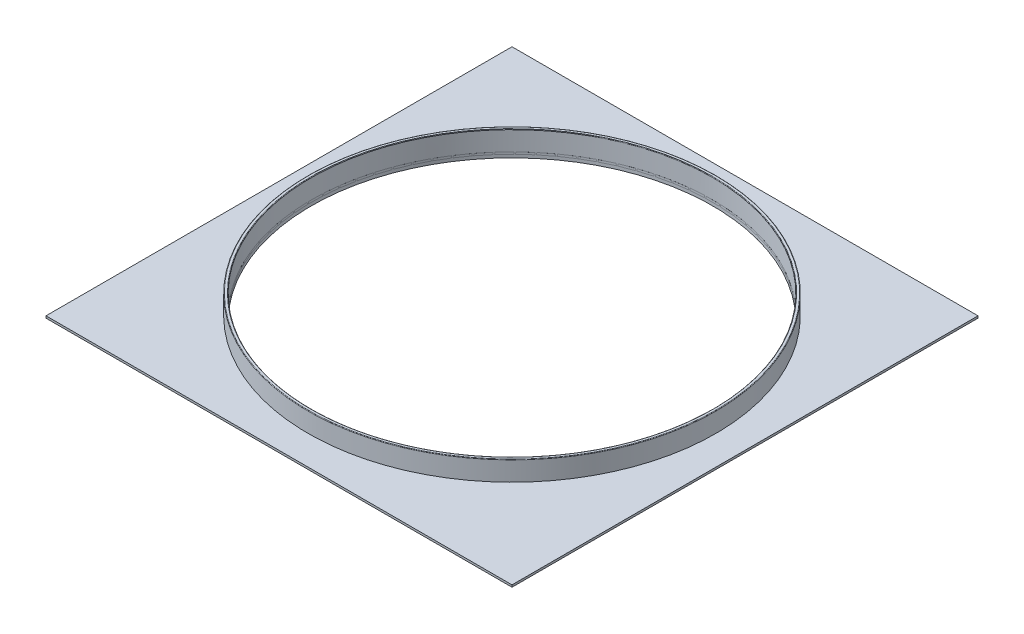
ISO-10303-21;
HEADER;
FILE_DESCRIPTION(('STEP AP214'),'2;1');
FILE_NAME('part.step','',(''),(''),'','','');
FILE_SCHEMA(('AUTOMOTIVE_DESIGN { 1 0 10303 214 1 1 1 1 }'));
ENDSEC;
DATA;
#1=APPLICATION_CONTEXT('core data for automotive mechanical design processes');
#2=APPLICATION_PROTOCOL_DEFINITION('international standard','automotive_design',2000,#1);
#3=PRODUCT_CONTEXT('',#1,'mechanical');
#4=PRODUCT('Part','Part','',(#3));
#5=PRODUCT_RELATED_PRODUCT_CATEGORY('part','',(#4));
#6=PRODUCT_DEFINITION_FORMATION('','',#4);
#7=PRODUCT_DEFINITION_CONTEXT('part definition',#1,'design');
#8=PRODUCT_DEFINITION('design','',#6,#7);
#9=PRODUCT_DEFINITION_SHAPE('','',#8);
#10=(LENGTH_UNIT() NAMED_UNIT(*) SI_UNIT(.MILLI.,.METRE.));
#11=(NAMED_UNIT(*) PLANE_ANGLE_UNIT() SI_UNIT($,.RADIAN.));
#12=(NAMED_UNIT(*) SI_UNIT($,.STERADIAN.) SOLID_ANGLE_UNIT());
#13=UNCERTAINTY_MEASURE_WITH_UNIT(LENGTH_MEASURE(1.E-05),#10,'distance_accuracy_value','');
#14=(GEOMETRIC_REPRESENTATION_CONTEXT(3) GLOBAL_UNCERTAINTY_ASSIGNED_CONTEXT((#13)) GLOBAL_UNIT_ASSIGNED_CONTEXT((#10,
#11,#12)) REPRESENTATION_CONTEXT('',''));
#15=CARTESIAN_POINT('',(0.,0.,0.));
#16=DIRECTION('',(0.,0.,1.));
#17=DIRECTION('',(1.,0.,0.));
#18=AXIS2_PLACEMENT_3D('',#15,#16,#17);
#19=CARTESIAN_POINT('',(0.,7.93749999999999,0.));
#20=DIRECTION('',(0.,1.,0.));
#21=DIRECTION('',(0.,0.,1.));
#22=AXIS2_PLACEMENT_3D('',#19,#20,#21);
#23=PLANE('',#22);
#24=DIRECTION('',(0.,0.,-1.));
#25=VECTOR('',#24,1.);
#26=CARTESIAN_POINT('',(355.6,7.93749999999999,-355.6));
#27=LINE('',#26,#25);
#28=CARTESIAN_POINT('',(355.6,7.93749999999998,355.6));
#29=VERTEX_POINT('',#28);
#30=CARTESIAN_POINT('',(355.6,7.93749999999999,-355.6));
#31=VERTEX_POINT('',#30);
#32=EDGE_CURVE('E99',#29,#31,#27,.T.);
#33=ORIENTED_EDGE('',*,*,#32,.T.);
#34=DIRECTION('',(-1.,0.,0.));
#35=VECTOR('',#34,1.);
#36=CARTESIAN_POINT('',(-355.6,7.93749999999999,-355.6));
#37=LINE('',#36,#35);
#38=CARTESIAN_POINT('',(-355.6,7.93749999999999,-355.6));
#39=VERTEX_POINT('',#38);
#40=EDGE_CURVE('E94',#31,#39,#37,.T.);
#41=ORIENTED_EDGE('',*,*,#40,.T.);
#42=DIRECTION('',(0.,0.,1.));
#43=VECTOR('',#42,1.);
#44=CARTESIAN_POINT('',(-355.6,7.93749999999999,-355.6));
#45=LINE('',#44,#43);
#46=CARTESIAN_POINT('',(-355.6,7.93749999999998,355.6));
#47=VERTEX_POINT('',#46);
#48=EDGE_CURVE('E97',#39,#47,#45,.T.);
#49=ORIENTED_EDGE('',*,*,#48,.T.);
#50=DIRECTION('',(1.,0.,0.));
#51=VECTOR('',#50,1.);
#52=CARTESIAN_POINT('',(-355.6,7.93749999999998,355.6));
#53=LINE('',#52,#51);
#54=EDGE_CURVE('E64',#47,#29,#53,.T.);
#55=ORIENTED_EDGE('',*,*,#54,.T.);
#56=EDGE_LOOP('',(#33,#41,#49,#55));
#57=FACE_BOUND('',#56,.T.);
#58=CARTESIAN_POINT('',(0.,7.93749999999999,0.));
#59=DIRECTION('',(0.,1.,0.));
#60=DIRECTION('',(0.,0.,1.));
#61=AXIS2_PLACEMENT_3D('',#58,#59,#60);
#62=CIRCLE('',#61,306.3875);
#63=CARTESIAN_POINT('',(0.,7.93749999999998,306.3875));
#64=VERTEX_POINT('',#63);
#65=EDGE_CURVE('E114',#64,#64,#62,.T.);
#66=ORIENTED_EDGE('',*,*,#65,.F.);
#67=EDGE_LOOP('',(#66));
#68=FACE_BOUND('',#67,.T.);
#69=ADVANCED_FACE('F47',(#57,#68),#23,.T.);
#70=CARTESIAN_POINT('',(0.,4.76249999999999,0.));
#71=DIRECTION('',(0.,1.,0.));
#72=DIRECTION('',(0.,0.,1.));
#73=AXIS2_PLACEMENT_3D('',#70,#71,#72);
#74=PLANE('',#73);
#75=DIRECTION('',(0.,0.,-1.));
#76=VECTOR('',#75,1.);
#77=CARTESIAN_POINT('',(355.6,4.76249999999999,-355.6));
#78=LINE('',#77,#76);
#79=CARTESIAN_POINT('',(355.6,4.76249999999998,355.6));
#80=VERTEX_POINT('',#79);
#81=CARTESIAN_POINT('',(355.6,4.76249999999999,-355.6));
#82=VERTEX_POINT('',#81);
#83=EDGE_CURVE('E111',#80,#82,#78,.T.);
#84=ORIENTED_EDGE('',*,*,#83,.F.);
#85=DIRECTION('',(1.,0.,0.));
#86=VECTOR('',#85,1.);
#87=CARTESIAN_POINT('',(-355.6,4.76249999999998,355.6));
#88=LINE('',#87,#86);
#89=CARTESIAN_POINT('',(-355.6,4.76249999999998,355.6));
#90=VERTEX_POINT('',#89);
#91=EDGE_CURVE('E87',#90,#80,#88,.T.);
#92=ORIENTED_EDGE('',*,*,#91,.F.);
#93=DIRECTION('',(0.,0.,1.));
#94=VECTOR('',#93,1.);
#95=CARTESIAN_POINT('',(-355.6,4.76249999999999,-355.6));
#96=LINE('',#95,#94);
#97=CARTESIAN_POINT('',(-355.6,4.76249999999999,-355.6));
#98=VERTEX_POINT('',#97);
#99=EDGE_CURVE('E81',#98,#90,#96,.T.);
#100=ORIENTED_EDGE('',*,*,#99,.F.);
#101=DIRECTION('',(-1.,0.,0.));
#102=VECTOR('',#101,1.);
#103=CARTESIAN_POINT('',(-355.6,4.76249999999999,-355.6));
#104=LINE('',#103,#102);
#105=EDGE_CURVE('E103',#82,#98,#104,.T.);
#106=ORIENTED_EDGE('',*,*,#105,.F.);
#107=EDGE_LOOP('',(#84,#92,#100,#106));
#108=FACE_BOUND('',#107,.T.);
#109=CARTESIAN_POINT('',(0.,4.76249999999999,0.));
#110=DIRECTION('',(0.,1.,0.));
#111=DIRECTION('',(0.,0.,1.));
#112=AXIS2_PLACEMENT_3D('',#109,#110,#111);
#113=CIRCLE('',#112,306.3875);
#114=CARTESIAN_POINT('',(0.,4.76249999999998,306.3875));
#115=VERTEX_POINT('',#114);
#116=EDGE_CURVE('E126',#115,#115,#113,.T.);
#117=ORIENTED_EDGE('',*,*,#116,.T.);
#118=EDGE_LOOP('',(#117));
#119=FACE_BOUND('',#118,.T.);
#120=ADVANCED_FACE('F122',(#108,#119),#74,.F.);
#121=CARTESIAN_POINT('',(355.6,7.93749999999999,-355.6));
#122=DIRECTION('',(-1.,0.,0.));
#123=DIRECTION('',(0.,0.,1.));
#124=AXIS2_PLACEMENT_3D('',#121,#122,#123);
#125=PLANE('',#124);
#126=ORIENTED_EDGE('',*,*,#83,.T.);
#127=DIRECTION('',(0.,-1.,0.));
#128=VECTOR('',#127,1.);
#129=CARTESIAN_POINT('',(355.6,7.93749999999999,-355.6));
#130=LINE('',#129,#128);
#131=EDGE_CURVE('E12',#31,#82,#130,.T.);
#132=ORIENTED_EDGE('',*,*,#131,.F.);
#133=ORIENTED_EDGE('',*,*,#32,.F.);
#134=DIRECTION('',(0.,-1.,0.));
#135=VECTOR('',#134,1.);
#136=CARTESIAN_POINT('',(355.6,7.93749999999998,355.6));
#137=LINE('',#136,#135);
#138=EDGE_CURVE('E107',#29,#80,#137,.T.);
#139=ORIENTED_EDGE('',*,*,#138,.T.);
#140=EDGE_LOOP('',(#126,#132,#133,#139));
#141=FACE_BOUND('',#140,.T.);
#142=ADVANCED_FACE('F49',(#141),#125,.F.);
#143=CARTESIAN_POINT('',(-355.6,7.93749999999999,-355.6));
#144=DIRECTION('',(0.,0.,1.));
#145=DIRECTION('',(0.,-1.,0.));
#146=AXIS2_PLACEMENT_3D('',#143,#144,#145);
#147=PLANE('',#146);
#148=ORIENTED_EDGE('',*,*,#105,.T.);
#149=DIRECTION('',(0.,-1.,0.));
#150=VECTOR('',#149,1.);
#151=CARTESIAN_POINT('',(-355.6,7.93749999999999,-355.6));
#152=LINE('',#151,#150);
#153=EDGE_CURVE('E56',#39,#98,#152,.T.);
#154=ORIENTED_EDGE('',*,*,#153,.F.);
#155=ORIENTED_EDGE('',*,*,#40,.F.);
#156=ORIENTED_EDGE('',*,*,#131,.T.);
#157=EDGE_LOOP('',(#148,#154,#155,#156));
#158=FACE_BOUND('',#157,.T.);
#159=ADVANCED_FACE('F102',(#158),#147,.F.);
#160=CARTESIAN_POINT('',(-355.6,7.93749999999999,-355.6));
#161=DIRECTION('',(1.,0.,0.));
#162=DIRECTION('',(0.,0.,-1.));
#163=AXIS2_PLACEMENT_3D('',#160,#161,#162);
#164=PLANE('',#163);
#165=ORIENTED_EDGE('',*,*,#99,.T.);
#166=DIRECTION('',(0.,-1.,0.));
#167=VECTOR('',#166,1.);
#168=CARTESIAN_POINT('',(-355.6,7.93749999999998,355.6));
#169=LINE('',#168,#167);
#170=EDGE_CURVE('E104',#47,#90,#169,.T.);
#171=ORIENTED_EDGE('',*,*,#170,.F.);
#172=ORIENTED_EDGE('',*,*,#48,.F.);
#173=ORIENTED_EDGE('',*,*,#153,.T.);
#174=EDGE_LOOP('',(#165,#171,#172,#173));
#175=FACE_BOUND('',#174,.T.);
#176=ADVANCED_FACE('F105',(#175),#164,.F.);
#177=CARTESIAN_POINT('',(-355.6,7.93749999999998,355.6));
#178=DIRECTION('',(0.,0.,-1.));
#179=DIRECTION('',(0.,1.,0.));
#180=AXIS2_PLACEMENT_3D('',#177,#178,#179);
#181=PLANE('',#180);
#182=ORIENTED_EDGE('',*,*,#91,.T.);
#183=ORIENTED_EDGE('',*,*,#138,.F.);
#184=ORIENTED_EDGE('',*,*,#54,.F.);
#185=ORIENTED_EDGE('',*,*,#170,.T.);
#186=EDGE_LOOP('',(#182,#183,#184,#185));
#187=FACE_BOUND('',#186,.T.);
#188=ADVANCED_FACE('F119',(#187),#181,.F.);
#189=CARTESIAN_POINT('',(0.,7.93749999999999,0.));
#190=DIRECTION('',(0.,-1.,0.));
#191=DIRECTION('',(0.,0.,-1.));
#192=AXIS2_PLACEMENT_3D('',#189,#190,#191);
#193=CYLINDRICAL_SURFACE('',#192,306.3875);
#194=ORIENTED_EDGE('',*,*,#65,.T.);
#195=EDGE_LOOP('',(#194));
#196=FACE_BOUND('',#195,.T.);
#197=ORIENTED_EDGE('',*,*,#116,.F.);
#198=EDGE_LOOP('',(#197));
#199=FACE_BOUND('',#198,.T.);
#200=ADVANCED_FACE('F132',(#196,#199),#193,.F.);
#201=CLOSED_SHELL('',(#69,#120,#142,#159,#176,#188,#200));
#202=MANIFOLD_SOLID_BREP('B2',#201);
#203=CARTESIAN_POINT('',(0.,38.1,0.));
#204=DIRECTION('',(0.,1.,0.));
#205=DIRECTION('',(0.,0.,1.));
#206=AXIS2_PLACEMENT_3D('',#203,#204,#205);
#207=CYLINDRICAL_SURFACE('',#206,349.25);
#208=CARTESIAN_POINT('',(0.,0.793749999999996,0.));
#209=DIRECTION('',(0.,1.,0.));
#210=DIRECTION('',(0.,0.,1.));
#211=AXIS2_PLACEMENT_3D('',#208,#209,#210);
#212=CIRCLE('',#211,349.25);
#213=CARTESIAN_POINT('',(0.,0.793749999999989,349.25));
#214=VERTEX_POINT('',#213);
#215=EDGE_CURVE('E232',#214,#214,#212,.T.);
#216=ORIENTED_EDGE('',*,*,#215,.T.);
#217=EDGE_LOOP('',(#216));
#218=FACE_BOUND('',#217,.T.);
#219=CARTESIAN_POINT('',(0.,3.96874999999999,0.));
#220=DIRECTION('',(0.,-1.,0.));
#221=DIRECTION('',(0.,0.,-1.));
#222=AXIS2_PLACEMENT_3D('',#219,#220,#221);
#223=CIRCLE('',#222,349.25);
#224=CARTESIAN_POINT('',(0.,3.96874999999999,-349.25));
#225=VERTEX_POINT('',#224);
#226=EDGE_CURVE('E236',#225,#225,#223,.T.);
#227=ORIENTED_EDGE('',*,*,#226,.T.);
#228=EDGE_LOOP('',(#227));
#229=FACE_BOUND('',#228,.T.);
#230=ADVANCED_FACE('F192',(#218,#229),#207,.T.);
#231=CARTESIAN_POINT('',(0.,4.76249999999999,-349.25));
#232=DIRECTION('',(0.,-1.,0.));
#233=DIRECTION('',(0.,0.,-1.));
#234=AXIS2_PLACEMENT_3D('',#231,#232,#233);
#235=PLANE('',#234);
#236=CARTESIAN_POINT('',(164.306249999996,4.76249999999998,-284.586773001116));
#237=DIRECTION('',(0.,1.,0.));
#238=DIRECTION('',(-0.499999999999989,0.,0.866025403784445));
#239=AXIS2_PLACEMENT_3D('',#236,#237,#238);
#240=CIRCLE('',#239,5.55625000000001);
#241=CARTESIAN_POINT('',(161.528124999996,4.76249999999998,-279.774919351339));
#242=VERTEX_POINT('',#241);
#243=EDGE_CURVE('E333',#242,#242,#240,.T.);
#244=ORIENTED_EDGE('',*,*,#243,.F.);
#245=EDGE_LOOP('',(#244));
#246=FACE_BOUND('',#245,.T.);
#247=CARTESIAN_POINT('',(284.586773001112,4.76249999999998,-164.306250000003));
#248=DIRECTION('',(0.,1.,0.));
#249=DIRECTION('',(-0.866025403784433,0.,0.50000000000001));
#250=AXIS2_PLACEMENT_3D('',#247,#248,#249);
#251=CIRCLE('',#250,5.55625000000001);
#252=CARTESIAN_POINT('',(279.774919351335,4.76249999999998,-161.528125000003));
#253=VERTEX_POINT('',#252);
#254=EDGE_CURVE('E325',#253,#253,#251,.T.);
#255=ORIENTED_EDGE('',*,*,#254,.F.);
#256=EDGE_LOOP('',(#255));
#257=FACE_BOUND('',#256,.T.);
#258=CARTESIAN_POINT('',(328.6125,4.76249999999997,-3.44193602804208E-12));
#259=DIRECTION('',(0.,1.,0.));
#260=DIRECTION('',(-1.,0.,0.));
#261=AXIS2_PLACEMENT_3D('',#258,#259,#260);
#262=CIRCLE('',#261,5.55625000000001);
#263=CARTESIAN_POINT('',(323.05625,4.76249999999997,-3.38373739847524E-12));
#264=VERTEX_POINT('',#263);
#265=EDGE_CURVE('E317',#264,#264,#262,.T.);
#266=ORIENTED_EDGE('',*,*,#265,.F.);
#267=EDGE_LOOP('',(#266));
#268=FACE_BOUND('',#267,.T.);
#269=CARTESIAN_POINT('',(284.586773001115,4.76249999999997,164.306249999997));
#270=DIRECTION('',(0.,1.,0.));
#271=DIRECTION('',(-0.866025403784443,0.,-0.499999999999992));
#272=AXIS2_PLACEMENT_3D('',#269,#270,#271);
#273=CIRCLE('',#272,5.55625000000001);
#274=CARTESIAN_POINT('',(279.774919351338,4.76249999999997,161.528124999997));
#275=VERTEX_POINT('',#274);
#276=EDGE_CURVE('E309',#275,#275,#273,.T.);
#277=ORIENTED_EDGE('',*,*,#276,.F.);
#278=EDGE_LOOP('',(#277));
#279=FACE_BOUND('',#278,.T.);
#280=CARTESIAN_POINT('',(164.306250000002,4.76249999999997,284.586773001113));
#281=DIRECTION('',(0.,1.,0.));
#282=DIRECTION('',(-0.500000000000007,0.,-0.866025403784435));
#283=AXIS2_PLACEMENT_3D('',#280,#281,#282);
#284=CIRCLE('',#283,5.55625000000001);
#285=CARTESIAN_POINT('',(161.528125000002,4.76249999999997,279.774919351335));
#286=VERTEX_POINT('',#285);
#287=EDGE_CURVE('E301',#286,#286,#284,.T.);
#288=ORIENTED_EDGE('',*,*,#287,.F.);
#289=EDGE_LOOP('',(#288));
#290=FACE_BOUND('',#289,.T.);
#291=CARTESIAN_POINT('',(0.,4.76249999999997,328.6125));
#292=DIRECTION('',(0.,1.,0.));
#293=DIRECTION('',(0.,0.,-1.));
#294=AXIS2_PLACEMENT_3D('',#291,#292,#293);
#295=CIRCLE('',#294,5.55625000000001);
#296=CARTESIAN_POINT('',(0.,4.76249999999997,323.05625));
#297=VERTEX_POINT('',#296);
#298=EDGE_CURVE('E293',#297,#297,#295,.T.);
#299=ORIENTED_EDGE('',*,*,#298,.F.);
#300=EDGE_LOOP('',(#299));
#301=FACE_BOUND('',#300,.T.);
#302=CARTESIAN_POINT('',(-164.306249999998,4.76249999999997,284.586773001115));
#303=DIRECTION('',(0.,1.,0.));
#304=DIRECTION('',(0.499999999999995,0.,-0.866025403784442));
#305=AXIS2_PLACEMENT_3D('',#302,#303,#304);
#306=CIRCLE('',#305,5.55625000000001);
#307=CARTESIAN_POINT('',(-161.528124999998,4.76249999999997,279.774919351337));
#308=VERTEX_POINT('',#307);
#309=EDGE_CURVE('E285',#308,#308,#306,.T.);
#310=ORIENTED_EDGE('',*,*,#309,.F.);
#311=EDGE_LOOP('',(#310));
#312=FACE_BOUND('',#311,.T.);
#313=CARTESIAN_POINT('',(-284.586773001113,4.76249999999997,164.306250000001));
#314=DIRECTION('',(0.,1.,0.));
#315=DIRECTION('',(0.866025403784436,0.,-0.500000000000004));
#316=AXIS2_PLACEMENT_3D('',#313,#314,#315);
#317=CIRCLE('',#316,5.55625000000001);
#318=CARTESIAN_POINT('',(-279.774919351336,4.76249999999997,161.528125000001));
#319=VERTEX_POINT('',#318);
#320=EDGE_CURVE('E277',#319,#319,#317,.T.);
#321=ORIENTED_EDGE('',*,*,#320,.F.);
#322=EDGE_LOOP('',(#321));
#323=FACE_BOUND('',#322,.T.);
#324=CARTESIAN_POINT('',(-328.6125,4.76249999999997,1.14744161780027E-12));
#325=DIRECTION('',(0.,1.,0.));
#326=DIRECTION('',(1.,0.,0.));
#327=AXIS2_PLACEMENT_3D('',#324,#325,#326);
#328=CIRCLE('',#327,5.55625000000001);
#329=CARTESIAN_POINT('',(-323.05625,4.76249999999997,1.12804207461132E-12));
#330=VERTEX_POINT('',#329);
#331=EDGE_CURVE('E269',#330,#330,#328,.T.);
#332=ORIENTED_EDGE('',*,*,#331,.F.);
#333=EDGE_LOOP('',(#332));
#334=FACE_BOUND('',#333,.T.);
#335=CARTESIAN_POINT('',(-284.586773001114,4.76249999999998,-164.306249999999));
#336=DIRECTION('',(0.,1.,0.));
#337=DIRECTION('',(0.86602540378444,0.,0.499999999999998));
#338=AXIS2_PLACEMENT_3D('',#335,#336,#337);
#339=CIRCLE('',#338,5.55625000000001);
#340=CARTESIAN_POINT('',(-279.774919351337,4.76249999999998,-161.528124999999));
#341=VERTEX_POINT('',#340);
#342=EDGE_CURVE('E261',#341,#341,#339,.T.);
#343=ORIENTED_EDGE('',*,*,#342,.F.);
#344=EDGE_LOOP('',(#343));
#345=FACE_BOUND('',#344,.T.);
#346=CARTESIAN_POINT('',(-164.30625,4.76249999999998,-284.586773001114));
#347=DIRECTION('',(0.,1.,0.));
#348=DIRECTION('',(0.500000000000001,0.,0.866025403784438));
#349=AXIS2_PLACEMENT_3D('',#346,#347,#348);
#350=CIRCLE('',#349,5.55625000000001);
#351=CARTESIAN_POINT('',(-161.528125,4.76249999999998,-279.774919351336));
#352=VERTEX_POINT('',#351);
#353=EDGE_CURVE('E253',#352,#352,#350,.T.);
#354=ORIENTED_EDGE('',*,*,#353,.F.);
#355=EDGE_LOOP('',(#354));
#356=FACE_BOUND('',#355,.T.);
#357=CARTESIAN_POINT('',(0.,4.76249999999998,-328.6125));
#358=DIRECTION('',(0.,1.,0.));
#359=DIRECTION('',(0.,0.,1.));
#360=AXIS2_PLACEMENT_3D('',#357,#358,#359);
#361=CIRCLE('',#360,5.55625000000001);
#362=CARTESIAN_POINT('',(0.,4.76249999999998,-323.05625));
#363=VERTEX_POINT('',#362);
#364=EDGE_CURVE('E245',#363,#363,#361,.T.);
#365=ORIENTED_EDGE('',*,*,#364,.F.);
#366=EDGE_LOOP('',(#365));
#367=FACE_BOUND('',#366,.T.);
#368=CARTESIAN_POINT('',(0.,4.76249999999999,0.));
#369=DIRECTION('',(0.,-1.,0.));
#370=DIRECTION('',(0.,0.,-1.));
#371=AXIS2_PLACEMENT_3D('',#368,#369,#370);
#372=CIRCLE('',#371,311.94375);
#373=CARTESIAN_POINT('',(0.,4.76249999999999,-311.94375));
#374=VERTEX_POINT('',#373);
#375=EDGE_CURVE('E46',#374,#374,#372,.T.);
#376=ORIENTED_EDGE('',*,*,#375,.T.);
#377=EDGE_LOOP('',(#376));
#378=FACE_BOUND('',#377,.T.);
#379=CARTESIAN_POINT('',(0.,4.76249999999999,0.));
#380=DIRECTION('',(0.,-1.,0.));
#381=DIRECTION('',(0.,0.,-1.));
#382=AXIS2_PLACEMENT_3D('',#379,#380,#381);
#383=CIRCLE('',#382,348.45625);
#384=CARTESIAN_POINT('',(0.,4.76249999999999,-348.45625));
#385=VERTEX_POINT('',#384);
#386=EDGE_CURVE('E224',#385,#385,#383,.F.);
#387=ORIENTED_EDGE('',*,*,#386,.T.);
#388=EDGE_LOOP('',(#387));
#389=FACE_BOUND('',#388,.T.);
#390=ADVANCED_FACE('F351',(#246,#257,#268,#279,#290,#301,#312,#323,#334,#345,#356,#367,#378,
#389),#235,.F.);
#391=CARTESIAN_POINT('',(0.,38.1,0.));
#392=DIRECTION('',(0.,1.,0.));
#393=DIRECTION('',(0.,0.,1.));
#394=AXIS2_PLACEMENT_3D('',#391,#392,#393);
#395=CYLINDRICAL_SURFACE('',#394,311.15);
#396=CARTESIAN_POINT('',(0.,37.30625,0.));
#397=DIRECTION('',(0.,-1.,0.));
#398=DIRECTION('',(0.,0.,-1.));
#399=AXIS2_PLACEMENT_3D('',#396,#397,#398);
#400=CIRCLE('',#399,311.15);
#401=CARTESIAN_POINT('',(0.,37.30625,-311.15));
#402=VERTEX_POINT('',#401);
#403=EDGE_CURVE('E205',#402,#402,#400,.T.);
#404=ORIENTED_EDGE('',*,*,#403,.T.);
#405=EDGE_LOOP('',(#404));
#406=FACE_BOUND('',#405,.T.);
#407=CARTESIAN_POINT('',(0.,5.55624999999998,0.));
#408=DIRECTION('',(0.,-1.,0.));
#409=DIRECTION('',(0.,0.,-1.));
#410=AXIS2_PLACEMENT_3D('',#407,#408,#409);
#411=CIRCLE('',#410,311.15);
#412=CARTESIAN_POINT('',(0.,5.55624999999999,-311.15));
#413=VERTEX_POINT('',#412);
#414=EDGE_CURVE('E210',#413,#413,#411,.F.);
#415=ORIENTED_EDGE('',*,*,#414,.T.);
#416=EDGE_LOOP('',(#415));
#417=FACE_BOUND('',#416,.T.);
#418=ADVANCED_FACE('F354',(#406,#417),#395,.T.);
#419=CARTESIAN_POINT('',(0.,38.1,-311.15));
#420=DIRECTION('',(0.,-1.,0.));
#421=DIRECTION('',(0.,0.,-1.));
#422=AXIS2_PLACEMENT_3D('',#419,#420,#421);
#423=PLANE('',#422);
#424=CARTESIAN_POINT('',(0.,38.1,0.));
#425=DIRECTION('',(0.,-1.,0.));
#426=DIRECTION('',(0.,0.,-1.));
#427=AXIS2_PLACEMENT_3D('',#424,#425,#426);
#428=CIRCLE('',#427,310.35625);
#429=CARTESIAN_POINT('',(0.,38.1,-310.35625));
#430=VERTEX_POINT('',#429);
#431=EDGE_CURVE('E216',#430,#430,#428,.F.);
#432=ORIENTED_EDGE('',*,*,#431,.T.);
#433=EDGE_LOOP('',(#432));
#434=FACE_BOUND('',#433,.T.);
#435=CARTESIAN_POINT('',(0.,38.1,0.));
#436=DIRECTION('',(0.,-1.,0.));
#437=DIRECTION('',(0.,0.,-1.));
#438=AXIS2_PLACEMENT_3D('',#435,#436,#437);
#439=CIRCLE('',#438,307.18125);
#440=CARTESIAN_POINT('',(0.,38.1,-307.18125));
#441=VERTEX_POINT('',#440);
#442=EDGE_CURVE('E220',#441,#441,#439,.T.);
#443=ORIENTED_EDGE('',*,*,#442,.T.);
#444=EDGE_LOOP('',(#443));
#445=FACE_BOUND('',#444,.T.);
#446=ADVANCED_FACE('F405',(#434,#445),#423,.F.);
#447=CARTESIAN_POINT('',(0.,38.1,0.));
#448=DIRECTION('',(0.,1.,0.));
#449=DIRECTION('',(0.,0.,1.));
#450=AXIS2_PLACEMENT_3D('',#447,#448,#449);
#451=CYLINDRICAL_SURFACE('',#450,306.3875);
#452=CARTESIAN_POINT('',(0.,37.30625,0.));
#453=DIRECTION('',(0.,-1.,0.));
#454=DIRECTION('',(0.,0.,-1.));
#455=AXIS2_PLACEMENT_3D('',#452,#453,#454);
#456=CIRCLE('',#455,306.3875);
#457=CARTESIAN_POINT('',(0.,37.30625,-306.3875));
#458=VERTEX_POINT('',#457);
#459=EDGE_CURVE('E200',#458,#458,#456,.F.);
#460=ORIENTED_EDGE('',*,*,#459,.T.);
#461=EDGE_LOOP('',(#460));
#462=FACE_BOUND('',#461,.T.);
#463=CARTESIAN_POINT('',(0.,0.,0.));
#464=DIRECTION('',(0.,1.,0.));
#465=DIRECTION('',(0.,0.,1.));
#466=AXIS2_PLACEMENT_3D('',#463,#464,#465);
#467=CIRCLE('',#466,306.3875);
#468=CARTESIAN_POINT('',(0.,0.,306.3875));
#469=VERTEX_POINT('',#468);
#470=EDGE_CURVE('E240',#469,#469,#467,.T.);
#471=ORIENTED_EDGE('',*,*,#470,.F.);
#472=EDGE_LOOP('',(#471));
#473=FACE_BOUND('',#472,.T.);
#474=ADVANCED_FACE('F409',(#462,#473),#451,.F.);
#475=CARTESIAN_POINT('',(0.,0.,-306.3875));
#476=DIRECTION('',(0.,1.,0.));
#477=DIRECTION('',(0.,0.,1.));
#478=AXIS2_PLACEMENT_3D('',#475,#476,#477);
#479=PLANE('',#478);
#480=CARTESIAN_POINT('',(164.306249999996,0.,-284.586773001116));
#481=DIRECTION('',(0.,1.,0.));
#482=DIRECTION('',(-0.499999999999989,0.,0.866025403784445));
#483=AXIS2_PLACEMENT_3D('',#480,#481,#482);
#484=CIRCLE('',#483,5.55625000000001);
#485=CARTESIAN_POINT('',(161.528124999996,0.,-279.774919351339));
#486=VERTEX_POINT('',#485);
#487=EDGE_CURVE('E329',#486,#486,#484,.T.);
#488=ORIENTED_EDGE('',*,*,#487,.T.);
#489=EDGE_LOOP('',(#488));
#490=FACE_BOUND('',#489,.T.);
#491=CARTESIAN_POINT('',(284.586773001112,0.,-164.306250000003));
#492=DIRECTION('',(0.,1.,0.));
#493=DIRECTION('',(-0.866025403784433,0.,0.50000000000001));
#494=AXIS2_PLACEMENT_3D('',#491,#492,#493);
#495=CIRCLE('',#494,5.55625000000001);
#496=CARTESIAN_POINT('',(279.774919351335,0.,-161.528125000003));
#497=VERTEX_POINT('',#496);
#498=EDGE_CURVE('E321',#497,#497,#495,.T.);
#499=ORIENTED_EDGE('',*,*,#498,.T.);
#500=EDGE_LOOP('',(#499));
#501=FACE_BOUND('',#500,.T.);
#502=CARTESIAN_POINT('',(328.6125,0.,-3.44203323438177E-12));
#503=DIRECTION('',(0.,1.,0.));
#504=DIRECTION('',(-1.,0.,0.));
#505=AXIS2_PLACEMENT_3D('',#502,#503,#504);
#506=CIRCLE('',#505,5.55625000000001);
#507=CARTESIAN_POINT('',(323.05625,0.,-3.38383460481493E-12));
#508=VERTEX_POINT('',#507);
#509=EDGE_CURVE('E313',#508,#508,#506,.T.);
#510=ORIENTED_EDGE('',*,*,#509,.T.);
#511=EDGE_LOOP('',(#510));
#512=FACE_BOUND('',#511,.T.);
#513=CARTESIAN_POINT('',(284.586773001115,0.,164.306249999997));
#514=DIRECTION('',(0.,1.,0.));
#515=DIRECTION('',(-0.866025403784443,0.,-0.499999999999992));
#516=AXIS2_PLACEMENT_3D('',#513,#514,#515);
#517=CIRCLE('',#516,5.55625000000001);
#518=CARTESIAN_POINT('',(279.774919351338,0.,161.528124999997));
#519=VERTEX_POINT('',#518);
#520=EDGE_CURVE('E305',#519,#519,#517,.T.);
#521=ORIENTED_EDGE('',*,*,#520,.T.);
#522=EDGE_LOOP('',(#521));
#523=FACE_BOUND('',#522,.T.);
#524=CARTESIAN_POINT('',(164.306250000002,0.,284.586773001113));
#525=DIRECTION('',(0.,1.,0.));
#526=DIRECTION('',(-0.500000000000007,0.,-0.866025403784435));
#527=AXIS2_PLACEMENT_3D('',#524,#525,#526);
#528=CIRCLE('',#527,5.55625000000001);
#529=CARTESIAN_POINT('',(161.528125000002,0.,279.774919351335));
#530=VERTEX_POINT('',#529);
#531=EDGE_CURVE('E297',#530,#530,#528,.T.);
#532=ORIENTED_EDGE('',*,*,#531,.T.);
#533=EDGE_LOOP('',(#532));
#534=FACE_BOUND('',#533,.T.);
#535=CARTESIAN_POINT('',(0.,0.,328.6125));
#536=DIRECTION('',(0.,1.,0.));
#537=DIRECTION('',(0.,0.,-1.));
#538=AXIS2_PLACEMENT_3D('',#535,#536,#537);
#539=CIRCLE('',#538,5.55625000000001);
#540=CARTESIAN_POINT('',(0.,0.,323.05625));
#541=VERTEX_POINT('',#540);
#542=EDGE_CURVE('E289',#541,#541,#539,.T.);
#543=ORIENTED_EDGE('',*,*,#542,.T.);
#544=EDGE_LOOP('',(#543));
#545=FACE_BOUND('',#544,.T.);
#546=CARTESIAN_POINT('',(-164.306249999998,0.,284.586773001115));
#547=DIRECTION('',(0.,1.,0.));
#548=DIRECTION('',(0.499999999999995,0.,-0.866025403784442));
#549=AXIS2_PLACEMENT_3D('',#546,#547,#548);
#550=CIRCLE('',#549,5.55625000000001);
#551=CARTESIAN_POINT('',(-161.528124999998,0.,279.774919351337));
#552=VERTEX_POINT('',#551);
#553=EDGE_CURVE('E281',#552,#552,#550,.T.);
#554=ORIENTED_EDGE('',*,*,#553,.T.);
#555=EDGE_LOOP('',(#554));
#556=FACE_BOUND('',#555,.T.);
#557=CARTESIAN_POINT('',(-284.586773001113,0.,164.306250000001));
#558=DIRECTION('',(0.,1.,0.));
#559=DIRECTION('',(0.866025403784436,0.,-0.500000000000004));
#560=AXIS2_PLACEMENT_3D('',#557,#558,#559);
#561=CIRCLE('',#560,5.55625000000001);
#562=CARTESIAN_POINT('',(-279.774919351336,0.,161.528125000001));
#563=VERTEX_POINT('',#562);
#564=EDGE_CURVE('E273',#563,#563,#561,.T.);
#565=ORIENTED_EDGE('',*,*,#564,.T.);
#566=EDGE_LOOP('',(#565));
#567=FACE_BOUND('',#566,.T.);
#568=CARTESIAN_POINT('',(-328.6125,0.,1.14734441146059E-12));
#569=DIRECTION('',(0.,1.,0.));
#570=DIRECTION('',(1.,0.,0.));
#571=AXIS2_PLACEMENT_3D('',#568,#569,#570);
#572=CIRCLE('',#571,5.55625000000001);
#573=CARTESIAN_POINT('',(-323.05625,0.,1.12794486827164E-12));
#574=VERTEX_POINT('',#573);
#575=EDGE_CURVE('E265',#574,#574,#572,.T.);
#576=ORIENTED_EDGE('',*,*,#575,.T.);
#577=EDGE_LOOP('',(#576));
#578=FACE_BOUND('',#577,.T.);
#579=CARTESIAN_POINT('',(-284.586773001114,0.,-164.306249999999));
#580=DIRECTION('',(0.,1.,0.));
#581=DIRECTION('',(0.86602540378444,0.,0.499999999999998));
#582=AXIS2_PLACEMENT_3D('',#579,#580,#581);
#583=CIRCLE('',#582,5.55625000000001);
#584=CARTESIAN_POINT('',(-279.774919351337,0.,-161.528124999999));
#585=VERTEX_POINT('',#584);
#586=EDGE_CURVE('E257',#585,#585,#583,.T.);
#587=ORIENTED_EDGE('',*,*,#586,.T.);
#588=EDGE_LOOP('',(#587));
#589=FACE_BOUND('',#588,.T.);
#590=CARTESIAN_POINT('',(-164.30625,0.,-284.586773001114));
#591=DIRECTION('',(0.,1.,0.));
#592=DIRECTION('',(0.500000000000001,0.,0.866025403784438));
#593=AXIS2_PLACEMENT_3D('',#590,#591,#592);
#594=CIRCLE('',#593,5.55625000000001);
#595=CARTESIAN_POINT('',(-161.528125,0.,-279.774919351336));
#596=VERTEX_POINT('',#595);
#597=EDGE_CURVE('E249',#596,#596,#594,.T.);
#598=ORIENTED_EDGE('',*,*,#597,.T.);
#599=EDGE_LOOP('',(#598));
#600=FACE_BOUND('',#599,.T.);
#601=CARTESIAN_POINT('',(0.,0.,-328.6125));
#602=DIRECTION('',(0.,1.,0.));
#603=DIRECTION('',(0.,0.,1.));
#604=AXIS2_PLACEMENT_3D('',#601,#602,#603);
#605=CIRCLE('',#604,5.55625000000001);
#606=CARTESIAN_POINT('',(0.,0.,-323.05625));
#607=VERTEX_POINT('',#606);
#608=EDGE_CURVE('E244',#607,#607,#605,.T.);
#609=ORIENTED_EDGE('',*,*,#608,.T.);
#610=EDGE_LOOP('',(#609));
#611=FACE_BOUND('',#610,.T.);
#612=CARTESIAN_POINT('',(0.,0.,0.));
#613=DIRECTION('',(0.,1.,0.));
#614=DIRECTION('',(0.,0.,1.));
#615=AXIS2_PLACEMENT_3D('',#612,#613,#614);
#616=CIRCLE('',#615,348.45625);
#617=CARTESIAN_POINT('',(0.,0.,348.45625));
#618=VERTEX_POINT('',#617);
#619=EDGE_CURVE('E228',#618,#618,#616,.F.);
#620=ORIENTED_EDGE('',*,*,#619,.T.);
#621=EDGE_LOOP('',(#620));
#622=FACE_BOUND('',#621,.T.);
#623=ORIENTED_EDGE('',*,*,#470,.T.);
#624=EDGE_LOOP('',(#623));
#625=FACE_BOUND('',#624,.T.);
#626=ADVANCED_FACE('F341',(#490,#501,#512,#523,#534,#545,#556,#567,#578,#589,#600,#611,#622,
#625),#479,.F.);
#627=CARTESIAN_POINT('',(0.,0.793749999999996,0.));
#628=DIRECTION('',(0.,1.,0.));
#629=DIRECTION('',(0.,0.,1.));
#630=AXIS2_PLACEMENT_3D('',#627,#628,#629);
#631=TOROIDAL_SURFACE('',#630,348.45625,0.79375);
#632=ORIENTED_EDGE('',*,*,#619,.F.);
#633=EDGE_LOOP('',(#632));
#634=FACE_BOUND('',#633,.T.);
#635=ORIENTED_EDGE('',*,*,#215,.F.);
#636=EDGE_LOOP('',(#635));
#637=FACE_BOUND('',#636,.T.);
#638=ADVANCED_FACE('F383',(#634,#637),#631,.T.);
#639=CARTESIAN_POINT('',(0.,3.96874999999999,0.));
#640=DIRECTION('',(0.,-1.,0.));
#641=DIRECTION('',(0.,0.,-1.));
#642=AXIS2_PLACEMENT_3D('',#639,#640,#641);
#643=TOROIDAL_SURFACE('',#642,348.45625,0.79375);
#644=ORIENTED_EDGE('',*,*,#226,.F.);
#645=EDGE_LOOP('',(#644));
#646=FACE_BOUND('',#645,.T.);
#647=ORIENTED_EDGE('',*,*,#386,.F.);
#648=EDGE_LOOP('',(#647));
#649=FACE_BOUND('',#648,.T.);
#650=ADVANCED_FACE('F380',(#646,#649),#643,.T.);
#651=CARTESIAN_POINT('',(0.,37.30625,0.));
#652=DIRECTION('',(0.,-1.,0.));
#653=DIRECTION('',(0.,0.,-1.));
#654=AXIS2_PLACEMENT_3D('',#651,#652,#653);
#655=TOROIDAL_SURFACE('',#654,310.35625,0.79375);
#656=ORIENTED_EDGE('',*,*,#403,.F.);
#657=EDGE_LOOP('',(#656));
#658=FACE_BOUND('',#657,.T.);
#659=ORIENTED_EDGE('',*,*,#431,.F.);
#660=EDGE_LOOP('',(#659));
#661=FACE_BOUND('',#660,.T.);
#662=ADVANCED_FACE('F382',(#658,#661),#655,.T.);
#663=CARTESIAN_POINT('',(0.,37.30625,0.));
#664=DIRECTION('',(0.,-1.,0.));
#665=DIRECTION('',(0.,0.,-1.));
#666=AXIS2_PLACEMENT_3D('',#663,#664,#665);
#667=TOROIDAL_SURFACE('',#666,307.18125,0.79375);
#668=ORIENTED_EDGE('',*,*,#442,.F.);
#669=EDGE_LOOP('',(#668));
#670=FACE_BOUND('',#669,.T.);
#671=ORIENTED_EDGE('',*,*,#459,.F.);
#672=EDGE_LOOP('',(#671));
#673=FACE_BOUND('',#672,.T.);
#674=ADVANCED_FACE('F390',(#670,#673),#667,.T.);
#675=CARTESIAN_POINT('',(0.,5.55624999999998,0.));
#676=DIRECTION('',(0.,-1.,0.));
#677=DIRECTION('',(0.,0.,-1.));
#678=AXIS2_PLACEMENT_3D('',#675,#676,#677);
#679=TOROIDAL_SURFACE('',#678,311.94375,0.79375);
#680=ORIENTED_EDGE('',*,*,#375,.F.);
#681=EDGE_LOOP('',(#680));
#682=FACE_BOUND('',#681,.T.);
#683=ORIENTED_EDGE('',*,*,#414,.F.);
#684=EDGE_LOOP('',(#683));
#685=FACE_BOUND('',#684,.T.);
#686=ADVANCED_FACE('F194',(#682,#685),#679,.F.);
#687=CARTESIAN_POINT('',(0.,0.,-328.6125));
#688=DIRECTION('',(0.,1.,0.));
#689=DIRECTION('',(0.,0.,1.));
#690=AXIS2_PLACEMENT_3D('',#687,#688,#689);
#691=CYLINDRICAL_SURFACE('',#690,5.55625000000001);
#692=ORIENTED_EDGE('',*,*,#608,.F.);
#693=EDGE_LOOP('',(#692));
#694=FACE_BOUND('',#693,.T.);
#695=ORIENTED_EDGE('',*,*,#364,.T.);
#696=EDGE_LOOP('',(#695));
#697=FACE_BOUND('',#696,.T.);
#698=ADVANCED_FACE('F415',(#694,#697),#691,.F.);
#699=CARTESIAN_POINT('',(-164.30625,0.,-284.586773001114));
#700=DIRECTION('',(0.,1.,0.));
#701=DIRECTION('',(-1.,0.,0.));
#702=AXIS2_PLACEMENT_3D('',#699,#700,#701);
#703=CYLINDRICAL_SURFACE('',#702,5.55625000000001);
#704=ORIENTED_EDGE('',*,*,#597,.F.);
#705=EDGE_LOOP('',(#704));
#706=FACE_BOUND('',#705,.T.);
#707=ORIENTED_EDGE('',*,*,#353,.T.);
#708=EDGE_LOOP('',(#707));
#709=FACE_BOUND('',#708,.T.);
#710=ADVANCED_FACE('F418',(#706,#709),#703,.F.);
#711=CARTESIAN_POINT('',(-284.586773001114,0.,-164.306249999999));
#712=DIRECTION('',(0.,1.,0.));
#713=DIRECTION('',(-1.,0.,0.));
#714=AXIS2_PLACEMENT_3D('',#711,#712,#713);
#715=CYLINDRICAL_SURFACE('',#714,5.55625000000001);
#716=ORIENTED_EDGE('',*,*,#586,.F.);
#717=EDGE_LOOP('',(#716));
#718=FACE_BOUND('',#717,.T.);
#719=ORIENTED_EDGE('',*,*,#342,.T.);
#720=EDGE_LOOP('',(#719));
#721=FACE_BOUND('',#720,.T.);
#722=ADVANCED_FACE('F422',(#718,#721),#715,.F.);
#723=CARTESIAN_POINT('',(-328.6125,0.,1.14734441146059E-12));
#724=DIRECTION('',(0.,1.,0.));
#725=DIRECTION('',(-1.,0.,0.));
#726=AXIS2_PLACEMENT_3D('',#723,#724,#725);
#727=CYLINDRICAL_SURFACE('',#726,5.55625000000001);
#728=ORIENTED_EDGE('',*,*,#575,.F.);
#729=EDGE_LOOP('',(#728));
#730=FACE_BOUND('',#729,.T.);
#731=ORIENTED_EDGE('',*,*,#331,.T.);
#732=EDGE_LOOP('',(#731));
#733=FACE_BOUND('',#732,.T.);
#734=ADVANCED_FACE('F426',(#730,#733),#727,.F.);
#735=CARTESIAN_POINT('',(-284.586773001113,0.,164.306250000001));
#736=DIRECTION('',(0.,1.,0.));
#737=DIRECTION('',(0.,0.,1.));
#738=AXIS2_PLACEMENT_3D('',#735,#736,#737);
#739=CYLINDRICAL_SURFACE('',#738,5.55625000000001);
#740=ORIENTED_EDGE('',*,*,#564,.F.);
#741=EDGE_LOOP('',(#740));
#742=FACE_BOUND('',#741,.T.);
#743=ORIENTED_EDGE('',*,*,#320,.T.);
#744=EDGE_LOOP('',(#743));
#745=FACE_BOUND('',#744,.T.);
#746=ADVANCED_FACE('F430',(#742,#745),#739,.F.);
#747=CARTESIAN_POINT('',(-164.306249999998,0.,284.586773001115));
#748=DIRECTION('',(0.,1.,0.));
#749=DIRECTION('',(0.,0.,1.));
#750=AXIS2_PLACEMENT_3D('',#747,#748,#749);
#751=CYLINDRICAL_SURFACE('',#750,5.55625000000001);
#752=ORIENTED_EDGE('',*,*,#553,.F.);
#753=EDGE_LOOP('',(#752));
#754=FACE_BOUND('',#753,.T.);
#755=ORIENTED_EDGE('',*,*,#309,.T.);
#756=EDGE_LOOP('',(#755));
#757=FACE_BOUND('',#756,.T.);
#758=ADVANCED_FACE('F434',(#754,#757),#751,.F.);
#759=CARTESIAN_POINT('',(0.,0.,328.6125));
#760=DIRECTION('',(0.,1.,0.));
#761=DIRECTION('',(0.,0.,1.));
#762=AXIS2_PLACEMENT_3D('',#759,#760,#761);
#763=CYLINDRICAL_SURFACE('',#762,5.55625000000001);
#764=ORIENTED_EDGE('',*,*,#542,.F.);
#765=EDGE_LOOP('',(#764));
#766=FACE_BOUND('',#765,.T.);
#767=ORIENTED_EDGE('',*,*,#298,.T.);
#768=EDGE_LOOP('',(#767));
#769=FACE_BOUND('',#768,.T.);
#770=ADVANCED_FACE('F438',(#766,#769),#763,.F.);
#771=CARTESIAN_POINT('',(164.306250000002,0.,284.586773001113));
#772=DIRECTION('',(0.,1.,0.));
#773=DIRECTION('',(0.,0.,1.));
#774=AXIS2_PLACEMENT_3D('',#771,#772,#773);
#775=CYLINDRICAL_SURFACE('',#774,5.55625000000001);
#776=ORIENTED_EDGE('',*,*,#531,.F.);
#777=EDGE_LOOP('',(#776));
#778=FACE_BOUND('',#777,.T.);
#779=ORIENTED_EDGE('',*,*,#287,.T.);
#780=EDGE_LOOP('',(#779));
#781=FACE_BOUND('',#780,.T.);
#782=ADVANCED_FACE('F442',(#778,#781),#775,.F.);
#783=CARTESIAN_POINT('',(284.586773001115,0.,164.306249999997));
#784=DIRECTION('',(0.,1.,0.));
#785=DIRECTION('',(0.,0.,1.));
#786=AXIS2_PLACEMENT_3D('',#783,#784,#785);
#787=CYLINDRICAL_SURFACE('',#786,5.55625000000001);
#788=ORIENTED_EDGE('',*,*,#520,.F.);
#789=EDGE_LOOP('',(#788));
#790=FACE_BOUND('',#789,.T.);
#791=ORIENTED_EDGE('',*,*,#276,.T.);
#792=EDGE_LOOP('',(#791));
#793=FACE_BOUND('',#792,.T.);
#794=ADVANCED_FACE('F446',(#790,#793),#787,.F.);
#795=CARTESIAN_POINT('',(328.6125,0.,-3.44203323438177E-12));
#796=DIRECTION('',(0.,1.,0.));
#797=DIRECTION('',(-1.,0.,0.));
#798=AXIS2_PLACEMENT_3D('',#795,#796,#797);
#799=CYLINDRICAL_SURFACE('',#798,5.55625000000001);
#800=ORIENTED_EDGE('',*,*,#509,.F.);
#801=EDGE_LOOP('',(#800));
#802=FACE_BOUND('',#801,.T.);
#803=ORIENTED_EDGE('',*,*,#265,.T.);
#804=EDGE_LOOP('',(#803));
#805=FACE_BOUND('',#804,.T.);
#806=ADVANCED_FACE('F450',(#802,#805),#799,.F.);
#807=CARTESIAN_POINT('',(284.586773001112,0.,-164.306250000003));
#808=DIRECTION('',(0.,1.,0.));
#809=DIRECTION('',(-1.,0.,0.));
#810=AXIS2_PLACEMENT_3D('',#807,#808,#809);
#811=CYLINDRICAL_SURFACE('',#810,5.55625000000001);
#812=ORIENTED_EDGE('',*,*,#498,.F.);
#813=EDGE_LOOP('',(#812));
#814=FACE_BOUND('',#813,.T.);
#815=ORIENTED_EDGE('',*,*,#254,.T.);
#816=EDGE_LOOP('',(#815));
#817=FACE_BOUND('',#816,.T.);
#818=ADVANCED_FACE('F347',(#814,#817),#811,.F.);
#819=CARTESIAN_POINT('',(164.306249999996,0.,-284.586773001116));
#820=DIRECTION('',(0.,1.,0.));
#821=DIRECTION('',(-1.,0.,0.));
#822=AXIS2_PLACEMENT_3D('',#819,#820,#821);
#823=CYLINDRICAL_SURFACE('',#822,5.55625000000001);
#824=ORIENTED_EDGE('',*,*,#487,.F.);
#825=EDGE_LOOP('',(#824));
#826=FACE_BOUND('',#825,.T.);
#827=ORIENTED_EDGE('',*,*,#243,.T.);
#828=EDGE_LOOP('',(#827));
#829=FACE_BOUND('',#828,.T.);
#830=ADVANCED_FACE('F344',(#826,#829),#823,.F.);
#831=CLOSED_SHELL('',(#230,#390,#418,#446,#474,#626,#638,#650,#662,#674,#686,#698,#710,#722,
#734,#746,#758,#770,#782,#794,#806,#818,#830));
#832=MANIFOLD_SOLID_BREP('B6',#831);
#833=ADVANCED_BREP_SHAPE_REPRESENTATION('',(#18,#202,#832),#14);
#834=SHAPE_DEFINITION_REPRESENTATION(#9,#833);
ENDSEC;
END-ISO-10303-21;
